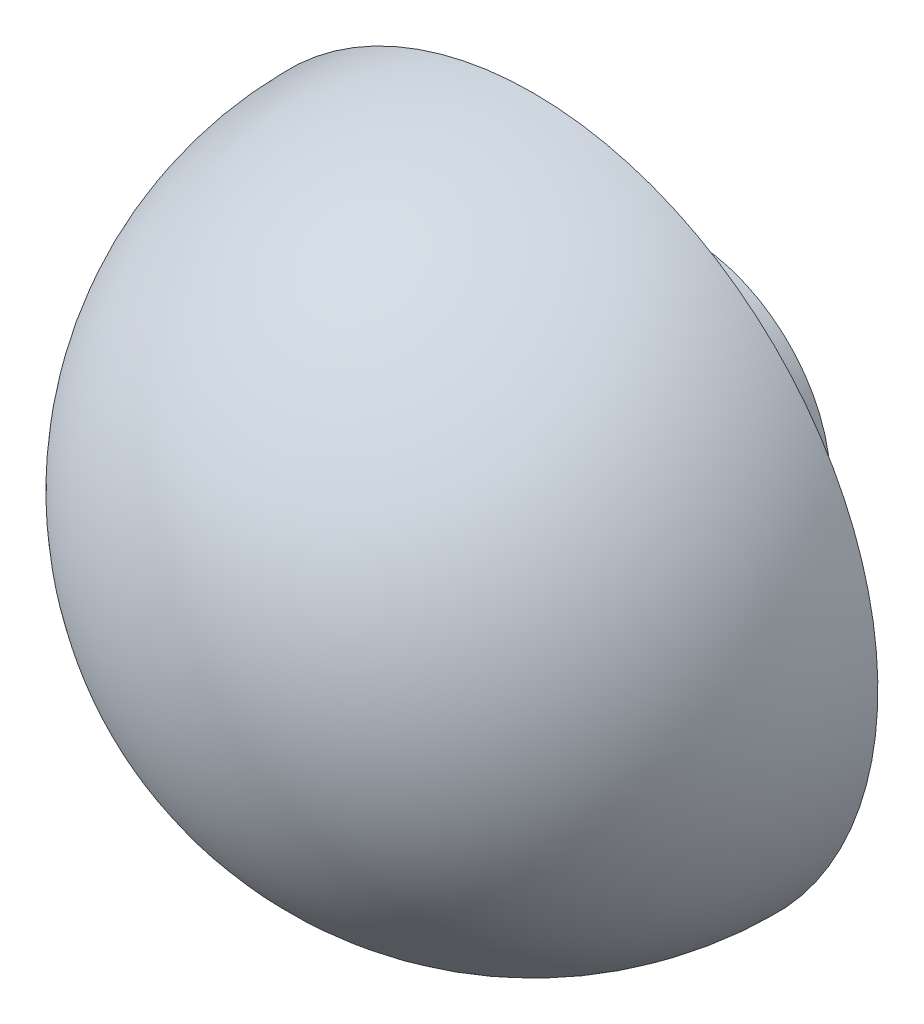
ISO-10303-21;
HEADER;
FILE_DESCRIPTION(('STEP AP214'),'2;1');
FILE_NAME('part.step','',(''),(''),'','','');
FILE_SCHEMA(('AUTOMOTIVE_DESIGN { 1 0 10303 214 1 1 1 1 }'));
ENDSEC;
DATA;
#1=APPLICATION_CONTEXT('core data for automotive mechanical design processes');
#2=APPLICATION_PROTOCOL_DEFINITION('international standard','automotive_design',2000,#1);
#3=PRODUCT_CONTEXT('',#1,'mechanical');
#4=PRODUCT('Part','Part','',(#3));
#5=PRODUCT_RELATED_PRODUCT_CATEGORY('part','',(#4));
#6=PRODUCT_DEFINITION_FORMATION('','',#4);
#7=PRODUCT_DEFINITION_CONTEXT('part definition',#1,'design');
#8=PRODUCT_DEFINITION('design','',#6,#7);
#9=PRODUCT_DEFINITION_SHAPE('','',#8);
#10=(LENGTH_UNIT() NAMED_UNIT(*) SI_UNIT(.MILLI.,.METRE.));
#11=(NAMED_UNIT(*) PLANE_ANGLE_UNIT() SI_UNIT($,.RADIAN.));
#12=(NAMED_UNIT(*) SI_UNIT($,.STERADIAN.) SOLID_ANGLE_UNIT());
#13=UNCERTAINTY_MEASURE_WITH_UNIT(LENGTH_MEASURE(1.E-05),#10,'distance_accuracy_value','');
#14=(GEOMETRIC_REPRESENTATION_CONTEXT(3) GLOBAL_UNCERTAINTY_ASSIGNED_CONTEXT((#13)) GLOBAL_UNIT_ASSIGNED_CONTEXT((#10,
#11,#12)) REPRESENTATION_CONTEXT('',''));
#15=CARTESIAN_POINT('',(0.,0.,0.));
#16=DIRECTION('',(0.,0.,1.));
#17=DIRECTION('',(1.,0.,0.));
#18=AXIS2_PLACEMENT_3D('',#15,#16,#17);
#19=CARTESIAN_POINT('',(0.,0.,0.));
#20=DIRECTION('',(0.,0.,-1.));
#21=DIRECTION('',(0.,1.,0.));
#22=AXIS2_PLACEMENT_3D('',#19,#20,#21);
#23=SPHERICAL_SURFACE('',#22,4.);
#24=CARTESIAN_POINT('',(0.,0.,0.));
#25=DIRECTION('',(0.,0.,-1.));
#26=DIRECTION('',(-1.,0.,0.));
#27=AXIS2_PLACEMENT_3D('',#24,#25,#26);
#28=CIRCLE('',#27,4.);
#29=CARTESIAN_POINT('',(-4.,0.,0.));
#30=VERTEX_POINT('',#29);
#31=EDGE_CURVE('E10',#30,#30,#28,.T.);
#32=ORIENTED_EDGE('',*,*,#31,.F.);
#33=EDGE_LOOP('',(#32));
#34=FACE_BOUND('',#33,.T.);
#35=ADVANCED_FACE('F40',(#34),#23,.T.);
#36=CARTESIAN_POINT('',(0.,4.,0.));
#37=DIRECTION('',(0.,0.,-1.));
#38=DIRECTION('',(-1.,0.,0.));
#39=AXIS2_PLACEMENT_3D('',#36,#37,#38);
#40=PLANE('',#39);
#41=ORIENTED_EDGE('',*,*,#31,.T.);
#42=EDGE_LOOP('',(#41));
#43=FACE_BOUND('',#42,.T.);
#44=CARTESIAN_POINT('',(0.,0.,0.));
#45=DIRECTION('',(0.,0.,-1.));
#46=DIRECTION('',(-1.,0.,0.));
#47=AXIS2_PLACEMENT_3D('',#44,#45,#46);
#48=CIRCLE('',#47,1.65);
#49=CARTESIAN_POINT('',(-1.65,0.,0.));
#50=VERTEX_POINT('',#49);
#51=EDGE_CURVE('E43',#50,#50,#48,.T.);
#52=ORIENTED_EDGE('',*,*,#51,.F.);
#53=EDGE_LOOP('',(#52));
#54=FACE_BOUND('',#53,.T.);
#55=ADVANCED_FACE('F59',(#43,#54),#40,.T.);
#56=CARTESIAN_POINT('',(0.,0.,-30.));
#57=DIRECTION('',(0.,0.,-1.));
#58=DIRECTION('',(-1.,0.,0.));
#59=AXIS2_PLACEMENT_3D('',#56,#57,#58);
#60=CYLINDRICAL_SURFACE('',#59,1.65);
#61=ORIENTED_EDGE('',*,*,#51,.T.);
#62=EDGE_LOOP('',(#61));
#63=FACE_BOUND('',#62,.T.);
#64=CARTESIAN_POINT('',(0.,0.,-1.8));
#65=DIRECTION('',(0.,0.,-1.));
#66=DIRECTION('',(-1.,0.,0.));
#67=AXIS2_PLACEMENT_3D('',#64,#65,#66);
#68=CIRCLE('',#67,1.65);
#69=CARTESIAN_POINT('',(-1.65,0.,-1.8));
#70=VERTEX_POINT('',#69);
#71=EDGE_CURVE('E50',#70,#70,#68,.T.);
#72=ORIENTED_EDGE('',*,*,#71,.F.);
#73=EDGE_LOOP('',(#72));
#74=FACE_BOUND('',#73,.T.);
#75=ADVANCED_FACE('F57',(#63,#74),#60,.T.);
#76=CARTESIAN_POINT('',(0.,1.65,-1.8));
#77=DIRECTION('',(0.,0.,-1.));
#78=DIRECTION('',(-1.,0.,0.));
#79=AXIS2_PLACEMENT_3D('',#76,#77,#78);
#80=PLANE('',#79);
#81=ORIENTED_EDGE('',*,*,#71,.T.);
#82=EDGE_LOOP('',(#81));
#83=FACE_BOUND('',#82,.T.);
#84=ADVANCED_FACE('F53',(#83),#80,.T.);
#85=CLOSED_SHELL('',(#35,#55,#75,#84));
#86=MANIFOLD_SOLID_BREP('B2',#85);
#87=ADVANCED_BREP_SHAPE_REPRESENTATION('',(#18,#86),#14);
#88=SHAPE_DEFINITION_REPRESENTATION(#9,#87);
ENDSEC;
END-ISO-10303-21;
